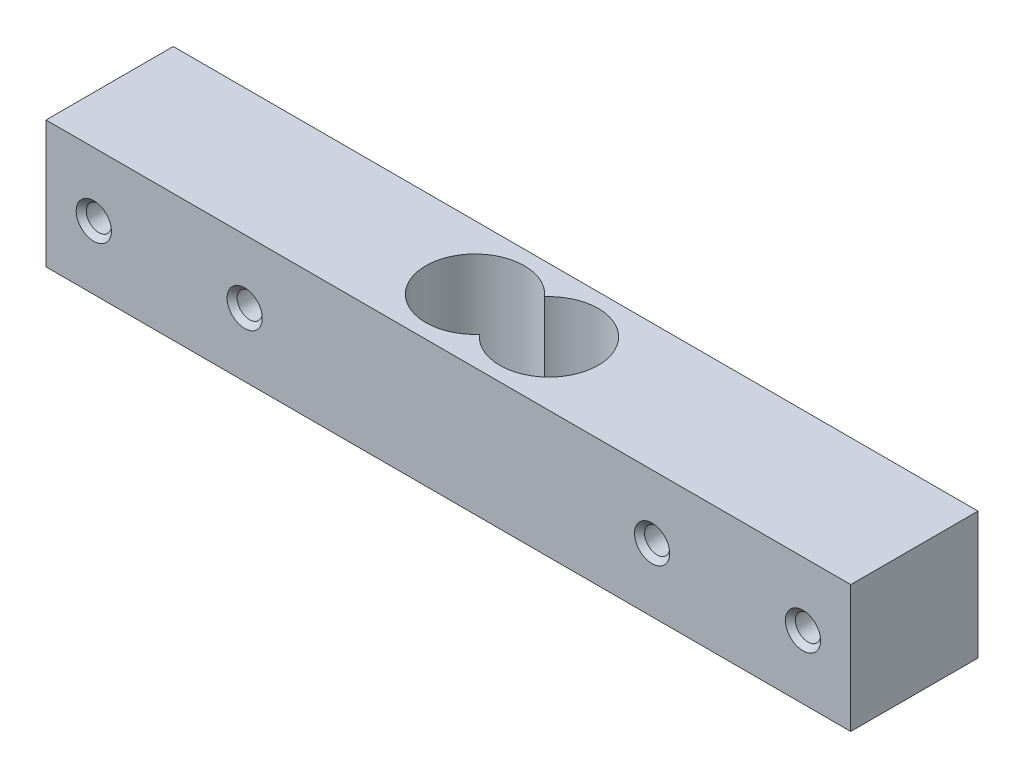
ISO-10303-21;
HEADER;
FILE_DESCRIPTION(('STEP AP214'),'2;1');
FILE_NAME('part.step','',(''),(''),'','','');
FILE_SCHEMA(('AUTOMOTIVE_DESIGN { 1 0 10303 214 1 1 1 1 }'));
ENDSEC;
DATA;
#1=APPLICATION_CONTEXT('core data for automotive mechanical design processes');
#2=APPLICATION_PROTOCOL_DEFINITION('international standard','automotive_design',2000,#1);
#3=PRODUCT_CONTEXT('',#1,'mechanical');
#4=PRODUCT('Part','Part','',(#3));
#5=PRODUCT_RELATED_PRODUCT_CATEGORY('part','',(#4));
#6=PRODUCT_DEFINITION_FORMATION('','',#4);
#7=PRODUCT_DEFINITION_CONTEXT('part definition',#1,'design');
#8=PRODUCT_DEFINITION('design','',#6,#7);
#9=PRODUCT_DEFINITION_SHAPE('','',#8);
#10=(LENGTH_UNIT() NAMED_UNIT(*) SI_UNIT(.MILLI.,.METRE.));
#11=(NAMED_UNIT(*) PLANE_ANGLE_UNIT() SI_UNIT($,.RADIAN.));
#12=(NAMED_UNIT(*) SI_UNIT($,.STERADIAN.) SOLID_ANGLE_UNIT());
#13=UNCERTAINTY_MEASURE_WITH_UNIT(LENGTH_MEASURE(1.E-05),#10,'distance_accuracy_value','');
#14=(GEOMETRIC_REPRESENTATION_CONTEXT(3) GLOBAL_UNCERTAINTY_ASSIGNED_CONTEXT((#13)) GLOBAL_UNIT_ASSIGNED_CONTEXT((#10,
#11,#12)) REPRESENTATION_CONTEXT('',''));
#15=CARTESIAN_POINT('',(0.,0.,0.));
#16=DIRECTION('',(0.,0.,1.));
#17=DIRECTION('',(1.,0.,0.));
#18=AXIS2_PLACEMENT_3D('',#15,#16,#17);
#19=CARTESIAN_POINT('',(0.,18.975,18.975));
#20=DIRECTION('',(0.,0.,-1.));
#21=DIRECTION('',(-1.,0.,0.));
#22=AXIS2_PLACEMENT_3D('',#19,#20,#21);
#23=PLANE('',#22);
#24=CARTESIAN_POINT('',(-105.75,0.,18.975));
#25=DIRECTION('',(0.,0.,-1.));
#26=DIRECTION('',(-1.,0.,0.));
#27=AXIS2_PLACEMENT_3D('',#24,#25,#26);
#28=CIRCLE('',#27,5.24999999999998);
#29=CARTESIAN_POINT('',(-111.,0.,18.975));
#30=VERTEX_POINT('',#29);
#31=EDGE_CURVE('E235',#30,#30,#28,.T.);
#32=ORIENTED_EDGE('',*,*,#31,.T.);
#33=EDGE_LOOP('',(#32));
#34=FACE_BOUND('',#33,.T.);
#35=CARTESIAN_POINT('',(-60.75,0.,18.975));
#36=DIRECTION('',(0.,0.,-1.));
#37=DIRECTION('',(-1.,0.,0.));
#38=AXIS2_PLACEMENT_3D('',#35,#36,#37);
#39=CIRCLE('',#38,5.24999999999999);
#40=CARTESIAN_POINT('',(-66.,0.,18.975));
#41=VERTEX_POINT('',#40);
#42=EDGE_CURVE('E247',#41,#41,#39,.T.);
#43=ORIENTED_EDGE('',*,*,#42,.T.);
#44=EDGE_LOOP('',(#43));
#45=FACE_BOUND('',#44,.T.);
#46=CARTESIAN_POINT('',(60.75,0.,18.975));
#47=DIRECTION('',(0.,0.,-1.));
#48=DIRECTION('',(-1.,0.,0.));
#49=AXIS2_PLACEMENT_3D('',#46,#47,#48);
#50=CIRCLE('',#49,5.24999999999999);
#51=CARTESIAN_POINT('',(55.5,0.,18.975));
#52=VERTEX_POINT('',#51);
#53=EDGE_CURVE('E260',#52,#52,#50,.T.);
#54=ORIENTED_EDGE('',*,*,#53,.T.);
#55=EDGE_LOOP('',(#54));
#56=FACE_BOUND('',#55,.T.);
#57=CARTESIAN_POINT('',(105.75,0.,18.975));
#58=DIRECTION('',(0.,0.,-1.));
#59=DIRECTION('',(-1.,0.,0.));
#60=AXIS2_PLACEMENT_3D('',#57,#58,#59);
#61=CIRCLE('',#60,5.24999999999998);
#62=CARTESIAN_POINT('',(100.5,0.,18.975));
#63=VERTEX_POINT('',#62);
#64=EDGE_CURVE('E215',#63,#63,#61,.T.);
#65=ORIENTED_EDGE('',*,*,#64,.T.);
#66=EDGE_LOOP('',(#65));
#67=FACE_BOUND('',#66,.T.);
#68=DIRECTION('',(1.,0.,0.));
#69=VECTOR('',#68,1.);
#70=CARTESIAN_POINT('',(0.,-18.975,18.975));
#71=LINE('',#70,#69);
#72=CARTESIAN_POINT('',(-120.,-18.975,18.975));
#73=VERTEX_POINT('',#72);
#74=CARTESIAN_POINT('',(120.,-18.975,18.975));
#75=VERTEX_POINT('',#74);
#76=EDGE_CURVE('E141',#73,#75,#71,.T.);
#77=ORIENTED_EDGE('',*,*,#76,.T.);
#78=DIRECTION('',(0.,-1.,0.));
#79=VECTOR('',#78,1.);
#80=CARTESIAN_POINT('',(120.,18.975,18.975));
#81=LINE('',#80,#79);
#82=CARTESIAN_POINT('',(120.,18.975,18.975));
#83=VERTEX_POINT('',#82);
#84=EDGE_CURVE('E11',#83,#75,#81,.T.);
#85=ORIENTED_EDGE('',*,*,#84,.F.);
#86=DIRECTION('',(1.,0.,0.));
#87=VECTOR('',#86,1.);
#88=CARTESIAN_POINT('',(0.,18.975,18.975));
#89=LINE('',#88,#87);
#90=CARTESIAN_POINT('',(-120.,18.975,18.975));
#91=VERTEX_POINT('',#90);
#92=EDGE_CURVE('E111',#91,#83,#89,.T.);
#93=ORIENTED_EDGE('',*,*,#92,.F.);
#94=DIRECTION('',(0.,-1.,0.));
#95=VECTOR('',#94,1.);
#96=CARTESIAN_POINT('',(-120.,18.975,18.975));
#97=LINE('',#96,#95);
#98=EDGE_CURVE('E63',#91,#73,#97,.T.);
#99=ORIENTED_EDGE('',*,*,#98,.T.);
#100=EDGE_LOOP('',(#77,#85,#93,#99));
#101=FACE_BOUND('',#100,.T.);
#102=ADVANCED_FACE('F43',(#34,#45,#56,#67,#101),#23,.F.);
#103=CARTESIAN_POINT('',(120.,18.975,0.));
#104=DIRECTION('',(-1.,0.,0.));
#105=DIRECTION('',(0.,0.,1.));
#106=AXIS2_PLACEMENT_3D('',#103,#104,#105);
#107=PLANE('',#106);
#108=DIRECTION('',(0.,0.,-1.));
#109=VECTOR('',#108,1.);
#110=CARTESIAN_POINT('',(120.,-18.975,0.));
#111=LINE('',#110,#109);
#112=CARTESIAN_POINT('',(120.,-18.975,-18.975));
#113=VERTEX_POINT('',#112);
#114=EDGE_CURVE('E118',#75,#113,#111,.T.);
#115=ORIENTED_EDGE('',*,*,#114,.T.);
#116=DIRECTION('',(0.,-1.,0.));
#117=VECTOR('',#116,1.);
#118=CARTESIAN_POINT('',(120.,18.975,-18.975));
#119=LINE('',#118,#117);
#120=CARTESIAN_POINT('',(120.,18.975,-18.975));
#121=VERTEX_POINT('',#120);
#122=EDGE_CURVE('E54',#121,#113,#119,.T.);
#123=ORIENTED_EDGE('',*,*,#122,.F.);
#124=DIRECTION('',(0.,0.,-1.));
#125=VECTOR('',#124,1.);
#126=CARTESIAN_POINT('',(120.,18.975,0.));
#127=LINE('',#126,#125);
#128=EDGE_CURVE('E105',#83,#121,#127,.T.);
#129=ORIENTED_EDGE('',*,*,#128,.F.);
#130=ORIENTED_EDGE('',*,*,#84,.T.);
#131=EDGE_LOOP('',(#115,#123,#129,#130));
#132=FACE_BOUND('',#131,.T.);
#133=ADVANCED_FACE('F117',(#132),#107,.F.);
#134=CARTESIAN_POINT('',(0.,18.975,-18.975));
#135=DIRECTION('',(0.,0.,-1.));
#136=DIRECTION('',(-1.,0.,0.));
#137=AXIS2_PLACEMENT_3D('',#134,#135,#136);
#138=PLANE('',#137);
#139=CARTESIAN_POINT('',(-105.75,0.,-18.975));
#140=DIRECTION('',(0.,0.,-1.));
#141=DIRECTION('',(-1.,0.,0.));
#142=AXIS2_PLACEMENT_3D('',#139,#140,#141);
#143=CIRCLE('',#142,5.25);
#144=CARTESIAN_POINT('',(-111.,0.,-18.975));
#145=VERTEX_POINT('',#144);
#146=EDGE_CURVE('E200',#145,#145,#143,.T.);
#147=ORIENTED_EDGE('',*,*,#146,.F.);
#148=EDGE_LOOP('',(#147));
#149=FACE_BOUND('',#148,.T.);
#150=CARTESIAN_POINT('',(-60.75,0.,-18.975));
#151=DIRECTION('',(0.,0.,-1.));
#152=DIRECTION('',(-1.,0.,0.));
#153=AXIS2_PLACEMENT_3D('',#150,#151,#152);
#154=CIRCLE('',#153,5.24999999999999);
#155=CARTESIAN_POINT('',(-66.,0.,-18.975));
#156=VERTEX_POINT('',#155);
#157=EDGE_CURVE('E204',#156,#156,#154,.T.);
#158=ORIENTED_EDGE('',*,*,#157,.F.);
#159=EDGE_LOOP('',(#158));
#160=FACE_BOUND('',#159,.T.);
#161=CARTESIAN_POINT('',(60.75,0.,-18.975));
#162=DIRECTION('',(0.,0.,-1.));
#163=DIRECTION('',(-1.,0.,0.));
#164=AXIS2_PLACEMENT_3D('',#161,#162,#163);
#165=CIRCLE('',#164,5.24999999999999);
#166=CARTESIAN_POINT('',(55.5,0.,-18.975));
#167=VERTEX_POINT('',#166);
#168=EDGE_CURVE('E208',#167,#167,#165,.T.);
#169=ORIENTED_EDGE('',*,*,#168,.F.);
#170=EDGE_LOOP('',(#169));
#171=FACE_BOUND('',#170,.T.);
#172=CARTESIAN_POINT('',(105.75,0.,-18.975));
#173=DIRECTION('',(0.,0.,-1.));
#174=DIRECTION('',(-1.,0.,0.));
#175=AXIS2_PLACEMENT_3D('',#172,#173,#174);
#176=CIRCLE('',#175,5.25);
#177=CARTESIAN_POINT('',(100.5,0.,-18.975));
#178=VERTEX_POINT('',#177);
#179=EDGE_CURVE('E211',#178,#178,#176,.T.);
#180=ORIENTED_EDGE('',*,*,#179,.F.);
#181=EDGE_LOOP('',(#180));
#182=FACE_BOUND('',#181,.T.);
#183=DIRECTION('',(1.,0.,0.));
#184=VECTOR('',#183,1.);
#185=CARTESIAN_POINT('',(0.,-18.975,-18.975));
#186=LINE('',#185,#184);
#187=CARTESIAN_POINT('',(-120.,-18.975,-18.975));
#188=VERTEX_POINT('',#187);
#189=EDGE_CURVE('E146',#188,#113,#186,.T.);
#190=ORIENTED_EDGE('',*,*,#189,.F.);
#191=DIRECTION('',(0.,-1.,0.));
#192=VECTOR('',#191,1.);
#193=CARTESIAN_POINT('',(-120.,18.975,-18.975));
#194=LINE('',#193,#192);
#195=CARTESIAN_POINT('',(-120.,18.975,-18.975));
#196=VERTEX_POINT('',#195);
#197=EDGE_CURVE('E83',#196,#188,#194,.T.);
#198=ORIENTED_EDGE('',*,*,#197,.F.);
#199=DIRECTION('',(1.,0.,0.));
#200=VECTOR('',#199,1.);
#201=CARTESIAN_POINT('',(0.,18.975,-18.975));
#202=LINE('',#201,#200);
#203=EDGE_CURVE('E110',#196,#121,#202,.T.);
#204=ORIENTED_EDGE('',*,*,#203,.T.);
#205=ORIENTED_EDGE('',*,*,#122,.T.);
#206=EDGE_LOOP('',(#190,#198,#204,#205));
#207=FACE_BOUND('',#206,.T.);
#208=ADVANCED_FACE('F123',(#149,#160,#171,#182,#207),#138,.T.);
#209=CARTESIAN_POINT('',(11.025,18.975,0.));
#210=DIRECTION('',(0.,-1.,0.));
#211=DIRECTION('',(0.,0.,-1.));
#212=AXIS2_PLACEMENT_3D('',#209,#210,#211);
#213=CYLINDRICAL_SURFACE('',#212,14.7);
#214=CARTESIAN_POINT('',(11.025,-18.975,0.));
#215=DIRECTION('',(0.,1.,0.));
#216=DIRECTION('',(0.,0.,1.));
#217=AXIS2_PLACEMENT_3D('',#214,#215,#216);
#218=CIRCLE('',#217,14.7);
#219=CARTESIAN_POINT('',(0.,-18.975,9.72313606816238));
#220=VERTEX_POINT('',#219);
#221=CARTESIAN_POINT('',(0.,-18.975,-9.72313606816238));
#222=VERTEX_POINT('',#221);
#223=EDGE_CURVE('E132',#220,#222,#218,.T.);
#224=ORIENTED_EDGE('',*,*,#223,.F.);
#225=DIRECTION('',(0.,-1.,0.));
#226=VECTOR('',#225,1.);
#227=CARTESIAN_POINT('',(0.,18.975,9.72313606816238));
#228=LINE('',#227,#226);
#229=CARTESIAN_POINT('',(0.,18.975,9.72313606816238));
#230=VERTEX_POINT('',#229);
#231=EDGE_CURVE('E47',#230,#220,#228,.T.);
#232=ORIENTED_EDGE('',*,*,#231,.F.);
#233=CARTESIAN_POINT('',(11.025,18.975,0.));
#234=DIRECTION('',(0.,1.,0.));
#235=DIRECTION('',(0.,0.,1.));
#236=AXIS2_PLACEMENT_3D('',#233,#234,#235);
#237=CIRCLE('',#236,14.7);
#238=CARTESIAN_POINT('',(0.,18.975,-9.72313606816238));
#239=VERTEX_POINT('',#238);
#240=EDGE_CURVE('E153',#230,#239,#237,.T.);
#241=ORIENTED_EDGE('',*,*,#240,.T.);
#242=DIRECTION('',(0.,-1.,0.));
#243=VECTOR('',#242,1.);
#244=CARTESIAN_POINT('',(0.,18.975,-9.72313606816238));
#245=LINE('',#244,#243);
#246=EDGE_CURVE('E128',#239,#222,#245,.T.);
#247=ORIENTED_EDGE('',*,*,#246,.T.);
#248=EDGE_LOOP('',(#224,#232,#241,#247));
#249=FACE_BOUND('',#248,.T.);
#250=ADVANCED_FACE('F45',(#249),#213,.F.);
#251=CARTESIAN_POINT('',(-11.025,18.975,0.));
#252=DIRECTION('',(0.,-1.,0.));
#253=DIRECTION('',(0.,0.,-1.));
#254=AXIS2_PLACEMENT_3D('',#251,#252,#253);
#255=CYLINDRICAL_SURFACE('',#254,14.7);
#256=CARTESIAN_POINT('',(-11.025,-18.975,0.));
#257=DIRECTION('',(0.,1.,0.));
#258=DIRECTION('',(0.,0.,1.));
#259=AXIS2_PLACEMENT_3D('',#256,#257,#258);
#260=CIRCLE('',#259,14.7);
#261=EDGE_CURVE('E136',#222,#220,#260,.T.);
#262=ORIENTED_EDGE('',*,*,#261,.F.);
#263=ORIENTED_EDGE('',*,*,#246,.F.);
#264=CARTESIAN_POINT('',(-11.025,18.975,0.));
#265=DIRECTION('',(0.,1.,0.));
#266=DIRECTION('',(0.,0.,1.));
#267=AXIS2_PLACEMENT_3D('',#264,#265,#266);
#268=CIRCLE('',#267,14.7);
#269=EDGE_CURVE('E166',#239,#230,#268,.T.);
#270=ORIENTED_EDGE('',*,*,#269,.T.);
#271=ORIENTED_EDGE('',*,*,#231,.T.);
#272=EDGE_LOOP('',(#262,#263,#270,#271));
#273=FACE_BOUND('',#272,.T.);
#274=ADVANCED_FACE('F164',(#273),#255,.F.);
#275=CARTESIAN_POINT('',(-120.,18.975,0.));
#276=DIRECTION('',(-1.,0.,0.));
#277=DIRECTION('',(0.,0.,1.));
#278=AXIS2_PLACEMENT_3D('',#275,#276,#277);
#279=PLANE('',#278);
#280=DIRECTION('',(0.,0.,-1.));
#281=VECTOR('',#280,1.);
#282=CARTESIAN_POINT('',(-120.,-18.975,0.));
#283=LINE('',#282,#281);
#284=EDGE_CURVE('E149',#73,#188,#283,.T.);
#285=ORIENTED_EDGE('',*,*,#284,.F.);
#286=ORIENTED_EDGE('',*,*,#98,.F.);
#287=DIRECTION('',(0.,0.,-1.));
#288=VECTOR('',#287,1.);
#289=CARTESIAN_POINT('',(-120.,18.975,0.));
#290=LINE('',#289,#288);
#291=EDGE_CURVE('E125',#91,#196,#290,.T.);
#292=ORIENTED_EDGE('',*,*,#291,.T.);
#293=ORIENTED_EDGE('',*,*,#197,.T.);
#294=EDGE_LOOP('',(#285,#286,#292,#293));
#295=FACE_BOUND('',#294,.T.);
#296=ADVANCED_FACE('F173',(#295),#279,.T.);
#297=CARTESIAN_POINT('',(0.,18.975,0.));
#298=DIRECTION('',(0.,1.,0.));
#299=DIRECTION('',(0.,0.,1.));
#300=AXIS2_PLACEMENT_3D('',#297,#298,#299);
#301=PLANE('',#300);
#302=ORIENTED_EDGE('',*,*,#240,.F.);
#303=ORIENTED_EDGE('',*,*,#269,.F.);
#304=EDGE_LOOP('',(#302,#303));
#305=FACE_BOUND('',#304,.T.);
#306=ORIENTED_EDGE('',*,*,#92,.T.);
#307=ORIENTED_EDGE('',*,*,#128,.T.);
#308=ORIENTED_EDGE('',*,*,#203,.F.);
#309=ORIENTED_EDGE('',*,*,#291,.F.);
#310=EDGE_LOOP('',(#306,#307,#308,#309));
#311=FACE_BOUND('',#310,.T.);
#312=ADVANCED_FACE('F107',(#305,#311),#301,.T.);
#313=CARTESIAN_POINT('',(0.,-18.975,0.));
#314=DIRECTION('',(0.,1.,0.));
#315=DIRECTION('',(0.,0.,1.));
#316=AXIS2_PLACEMENT_3D('',#313,#314,#315);
#317=PLANE('',#316);
#318=ORIENTED_EDGE('',*,*,#223,.T.);
#319=ORIENTED_EDGE('',*,*,#261,.T.);
#320=EDGE_LOOP('',(#318,#319));
#321=FACE_BOUND('',#320,.T.);
#322=ORIENTED_EDGE('',*,*,#76,.F.);
#323=ORIENTED_EDGE('',*,*,#284,.T.);
#324=ORIENTED_EDGE('',*,*,#189,.T.);
#325=ORIENTED_EDGE('',*,*,#114,.F.);
#326=EDGE_LOOP('',(#322,#323,#324,#325));
#327=FACE_BOUND('',#326,.T.);
#328=ADVANCED_FACE('F168',(#321,#327),#317,.F.);
#329=CARTESIAN_POINT('',(105.75,0.,17.475));
#330=DIRECTION('',(0.,0.,1.));
#331=DIRECTION('',(1.,0.,0.));
#332=AXIS2_PLACEMENT_3D('',#329,#330,#331);
#333=CONICAL_SURFACE('',#332,3.74999999999998,0.785398163397448);
#334=ORIENTED_EDGE('',*,*,#64,.F.);
#335=EDGE_LOOP('',(#334));
#336=FACE_BOUND('',#335,.T.);
#337=CARTESIAN_POINT('',(105.75,0.,17.475));
#338=DIRECTION('',(0.,0.,-1.));
#339=DIRECTION('',(-1.,0.,0.));
#340=AXIS2_PLACEMENT_3D('',#337,#338,#339);
#341=CIRCLE('',#340,3.74999999999998);
#342=CARTESIAN_POINT('',(102.,0.,17.475));
#343=VERTEX_POINT('',#342);
#344=EDGE_CURVE('E137',#343,#343,#341,.T.);
#345=ORIENTED_EDGE('',*,*,#344,.T.);
#346=EDGE_LOOP('',(#345));
#347=FACE_BOUND('',#346,.T.);
#348=ADVANCED_FACE('F171',(#336,#347),#333,.F.);
#349=CARTESIAN_POINT('',(105.75,0.,-18.975));
#350=DIRECTION('',(0.,0.,-1.));
#351=DIRECTION('',(-1.,0.,0.));
#352=AXIS2_PLACEMENT_3D('',#349,#350,#351);
#353=CYLINDRICAL_SURFACE('',#352,3.74999999999997);
#354=ORIENTED_EDGE('',*,*,#344,.F.);
#355=EDGE_LOOP('',(#354));
#356=FACE_BOUND('',#355,.T.);
#357=CARTESIAN_POINT('',(105.75,0.,-17.4749999999999));
#358=DIRECTION('',(0.,0.,-1.));
#359=DIRECTION('',(-1.,0.,0.));
#360=AXIS2_PLACEMENT_3D('',#357,#358,#359);
#361=CIRCLE('',#360,3.74999999999996);
#362=CARTESIAN_POINT('',(102.,0.,-17.4749999999999));
#363=VERTEX_POINT('',#362);
#364=EDGE_CURVE('E214',#363,#363,#361,.T.);
#365=ORIENTED_EDGE('',*,*,#364,.T.);
#366=EDGE_LOOP('',(#365));
#367=FACE_BOUND('',#366,.T.);
#368=ADVANCED_FACE('F300',(#356,#367),#353,.F.);
#369=CARTESIAN_POINT('',(105.75,0.,-18.975));
#370=DIRECTION('',(0.,0.,-1.));
#371=DIRECTION('',(-1.,0.,0.));
#372=AXIS2_PLACEMENT_3D('',#369,#370,#371);
#373=CONICAL_SURFACE('',#372,5.25,0.785398163397433);
#374=ORIENTED_EDGE('',*,*,#364,.F.);
#375=EDGE_LOOP('',(#374));
#376=FACE_BOUND('',#375,.T.);
#377=ORIENTED_EDGE('',*,*,#179,.T.);
#378=EDGE_LOOP('',(#377));
#379=FACE_BOUND('',#378,.T.);
#380=ADVANCED_FACE('F296',(#376,#379),#373,.F.);
#381=CARTESIAN_POINT('',(60.75,0.,17.475));
#382=DIRECTION('',(0.,0.,1.));
#383=DIRECTION('',(1.,0.,0.));
#384=AXIS2_PLACEMENT_3D('',#381,#382,#383);
#385=CONICAL_SURFACE('',#384,3.74999999999999,0.785398163397448);
#386=ORIENTED_EDGE('',*,*,#53,.F.);
#387=EDGE_LOOP('',(#386));
#388=FACE_BOUND('',#387,.T.);
#389=CARTESIAN_POINT('',(60.75,0.,17.475));
#390=DIRECTION('',(0.,0.,-1.));
#391=DIRECTION('',(-1.,0.,0.));
#392=AXIS2_PLACEMENT_3D('',#389,#390,#391);
#393=CIRCLE('',#392,3.74999999999999);
#394=CARTESIAN_POINT('',(57.,0.,17.475));
#395=VERTEX_POINT('',#394);
#396=EDGE_CURVE('E222',#395,#395,#393,.T.);
#397=ORIENTED_EDGE('',*,*,#396,.T.);
#398=EDGE_LOOP('',(#397));
#399=FACE_BOUND('',#398,.T.);
#400=ADVANCED_FACE('F273',(#388,#399),#385,.F.);
#401=CARTESIAN_POINT('',(60.75,0.,-18.975));
#402=DIRECTION('',(0.,0.,-1.));
#403=DIRECTION('',(-1.,0.,0.));
#404=AXIS2_PLACEMENT_3D('',#401,#402,#403);
#405=CYLINDRICAL_SURFACE('',#404,3.74999999999998);
#406=ORIENTED_EDGE('',*,*,#396,.F.);
#407=EDGE_LOOP('',(#406));
#408=FACE_BOUND('',#407,.T.);
#409=CARTESIAN_POINT('',(60.75,0.,-17.4749999999999));
#410=DIRECTION('',(0.,0.,-1.));
#411=DIRECTION('',(-1.,0.,0.));
#412=AXIS2_PLACEMENT_3D('',#409,#410,#411);
#413=CIRCLE('',#412,3.74999999999996);
#414=CARTESIAN_POINT('',(57.,0.,-17.4749999999999));
#415=VERTEX_POINT('',#414);
#416=EDGE_CURVE('E266',#415,#415,#413,.T.);
#417=ORIENTED_EDGE('',*,*,#416,.T.);
#418=EDGE_LOOP('',(#417));
#419=FACE_BOUND('',#418,.T.);
#420=ADVANCED_FACE('F275',(#408,#419),#405,.F.);
#421=CARTESIAN_POINT('',(60.75,0.,-18.975));
#422=DIRECTION('',(0.,0.,-1.));
#423=DIRECTION('',(-1.,0.,0.));
#424=AXIS2_PLACEMENT_3D('',#421,#422,#423);
#425=CONICAL_SURFACE('',#424,5.24999999999999,0.785398163397429);
#426=ORIENTED_EDGE('',*,*,#416,.F.);
#427=EDGE_LOOP('',(#426));
#428=FACE_BOUND('',#427,.T.);
#429=ORIENTED_EDGE('',*,*,#168,.T.);
#430=EDGE_LOOP('',(#429));
#431=FACE_BOUND('',#430,.T.);
#432=ADVANCED_FACE('F278',(#428,#431),#425,.F.);
#433=CARTESIAN_POINT('',(-60.75,0.,17.475));
#434=DIRECTION('',(0.,0.,1.));
#435=DIRECTION('',(1.,0.,0.));
#436=AXIS2_PLACEMENT_3D('',#433,#434,#435);
#437=CONICAL_SURFACE('',#436,3.74999999999999,0.785398163397448);
#438=ORIENTED_EDGE('',*,*,#42,.F.);
#439=EDGE_LOOP('',(#438));
#440=FACE_BOUND('',#439,.T.);
#441=CARTESIAN_POINT('',(-60.75,0.,17.475));
#442=DIRECTION('',(0.,0.,-1.));
#443=DIRECTION('',(-1.,0.,0.));
#444=AXIS2_PLACEMENT_3D('',#441,#442,#443);
#445=CIRCLE('',#444,3.74999999999999);
#446=CARTESIAN_POINT('',(-64.5,0.,17.475));
#447=VERTEX_POINT('',#446);
#448=EDGE_CURVE('E256',#447,#447,#445,.T.);
#449=ORIENTED_EDGE('',*,*,#448,.T.);
#450=EDGE_LOOP('',(#449));
#451=FACE_BOUND('',#450,.T.);
#452=ADVANCED_FACE('F284',(#440,#451),#437,.F.);
#453=CARTESIAN_POINT('',(-60.75,0.,-18.975));
#454=DIRECTION('',(0.,0.,-1.));
#455=DIRECTION('',(-1.,0.,0.));
#456=AXIS2_PLACEMENT_3D('',#453,#454,#455);
#457=CYLINDRICAL_SURFACE('',#456,3.74999999999998);
#458=ORIENTED_EDGE('',*,*,#448,.F.);
#459=EDGE_LOOP('',(#458));
#460=FACE_BOUND('',#459,.T.);
#461=CARTESIAN_POINT('',(-60.75,0.,-17.4749999999999));
#462=DIRECTION('',(0.,0.,-1.));
#463=DIRECTION('',(-1.,0.,0.));
#464=AXIS2_PLACEMENT_3D('',#461,#462,#463);
#465=CIRCLE('',#464,3.74999999999996);
#466=CARTESIAN_POINT('',(-64.5,0.,-17.4749999999999));
#467=VERTEX_POINT('',#466);
#468=EDGE_CURVE('E252',#467,#467,#465,.T.);
#469=ORIENTED_EDGE('',*,*,#468,.T.);
#470=EDGE_LOOP('',(#469));
#471=FACE_BOUND('',#470,.T.);
#472=ADVANCED_FACE('F289',(#460,#471),#457,.F.);
#473=CARTESIAN_POINT('',(-60.75,0.,-18.975));
#474=DIRECTION('',(0.,0.,-1.));
#475=DIRECTION('',(-1.,0.,0.));
#476=AXIS2_PLACEMENT_3D('',#473,#474,#475);
#477=CONICAL_SURFACE('',#476,5.24999999999999,0.785398163397429);
#478=ORIENTED_EDGE('',*,*,#468,.F.);
#479=EDGE_LOOP('',(#478));
#480=FACE_BOUND('',#479,.T.);
#481=ORIENTED_EDGE('',*,*,#157,.T.);
#482=EDGE_LOOP('',(#481));
#483=FACE_BOUND('',#482,.T.);
#484=ADVANCED_FACE('F349',(#480,#483),#477,.F.);
#485=CARTESIAN_POINT('',(-105.75,0.,17.475));
#486=DIRECTION('',(0.,0.,1.));
#487=DIRECTION('',(1.,0.,0.));
#488=AXIS2_PLACEMENT_3D('',#485,#486,#487);
#489=CONICAL_SURFACE('',#488,3.74999999999998,0.785398163397448);
#490=ORIENTED_EDGE('',*,*,#31,.F.);
#491=EDGE_LOOP('',(#490));
#492=FACE_BOUND('',#491,.T.);
#493=CARTESIAN_POINT('',(-105.75,0.,17.475));
#494=DIRECTION('',(0.,0.,-1.));
#495=DIRECTION('',(-1.,0.,0.));
#496=AXIS2_PLACEMENT_3D('',#493,#494,#495);
#497=CIRCLE('',#496,3.74999999999998);
#498=CARTESIAN_POINT('',(-109.5,0.,17.475));
#499=VERTEX_POINT('',#498);
#500=EDGE_CURVE('E243',#499,#499,#497,.T.);
#501=ORIENTED_EDGE('',*,*,#500,.T.);
#502=EDGE_LOOP('',(#501));
#503=FACE_BOUND('',#502,.T.);
#504=ADVANCED_FACE('F357',(#492,#503),#489,.F.);
#505=CARTESIAN_POINT('',(-105.75,0.,-18.975));
#506=DIRECTION('',(0.,0.,-1.));
#507=DIRECTION('',(-1.,0.,0.));
#508=AXIS2_PLACEMENT_3D('',#505,#506,#507);
#509=CYLINDRICAL_SURFACE('',#508,3.74999999999997);
#510=ORIENTED_EDGE('',*,*,#500,.F.);
#511=EDGE_LOOP('',(#510));
#512=FACE_BOUND('',#511,.T.);
#513=CARTESIAN_POINT('',(-105.75,0.,-17.4749999999999));
#514=DIRECTION('',(0.,0.,-1.));
#515=DIRECTION('',(-1.,0.,0.));
#516=AXIS2_PLACEMENT_3D('',#513,#514,#515);
#517=CIRCLE('',#516,3.74999999999996);
#518=CARTESIAN_POINT('',(-109.5,0.,-17.4749999999999));
#519=VERTEX_POINT('',#518);
#520=EDGE_CURVE('E234',#519,#519,#517,.T.);
#521=ORIENTED_EDGE('',*,*,#520,.T.);
#522=EDGE_LOOP('',(#521));
#523=FACE_BOUND('',#522,.T.);
#524=ADVANCED_FACE('F366',(#512,#523),#509,.F.);
#525=CARTESIAN_POINT('',(-105.75,0.,-18.975));
#526=DIRECTION('',(0.,0.,-1.));
#527=DIRECTION('',(-1.,0.,0.));
#528=AXIS2_PLACEMENT_3D('',#525,#526,#527);
#529=CONICAL_SURFACE('',#528,5.25,0.785398163397433);
#530=ORIENTED_EDGE('',*,*,#520,.F.);
#531=EDGE_LOOP('',(#530));
#532=FACE_BOUND('',#531,.T.);
#533=ORIENTED_EDGE('',*,*,#146,.T.);
#534=EDGE_LOOP('',(#533));
#535=FACE_BOUND('',#534,.T.);
#536=ADVANCED_FACE('F375',(#532,#535),#529,.F.);
#537=CLOSED_SHELL('',(#102,#133,#208,#250,#274,#296,#312,#328,#348,#368,#380,#400,#420,#432,
#452,#472,#484,#504,#524,#536));
#538=MANIFOLD_SOLID_BREP('B2',#537);
#539=ADVANCED_BREP_SHAPE_REPRESENTATION('',(#18,#538),#14);
#540=SHAPE_DEFINITION_REPRESENTATION(#9,#539);
ENDSEC;
END-ISO-10303-21;
